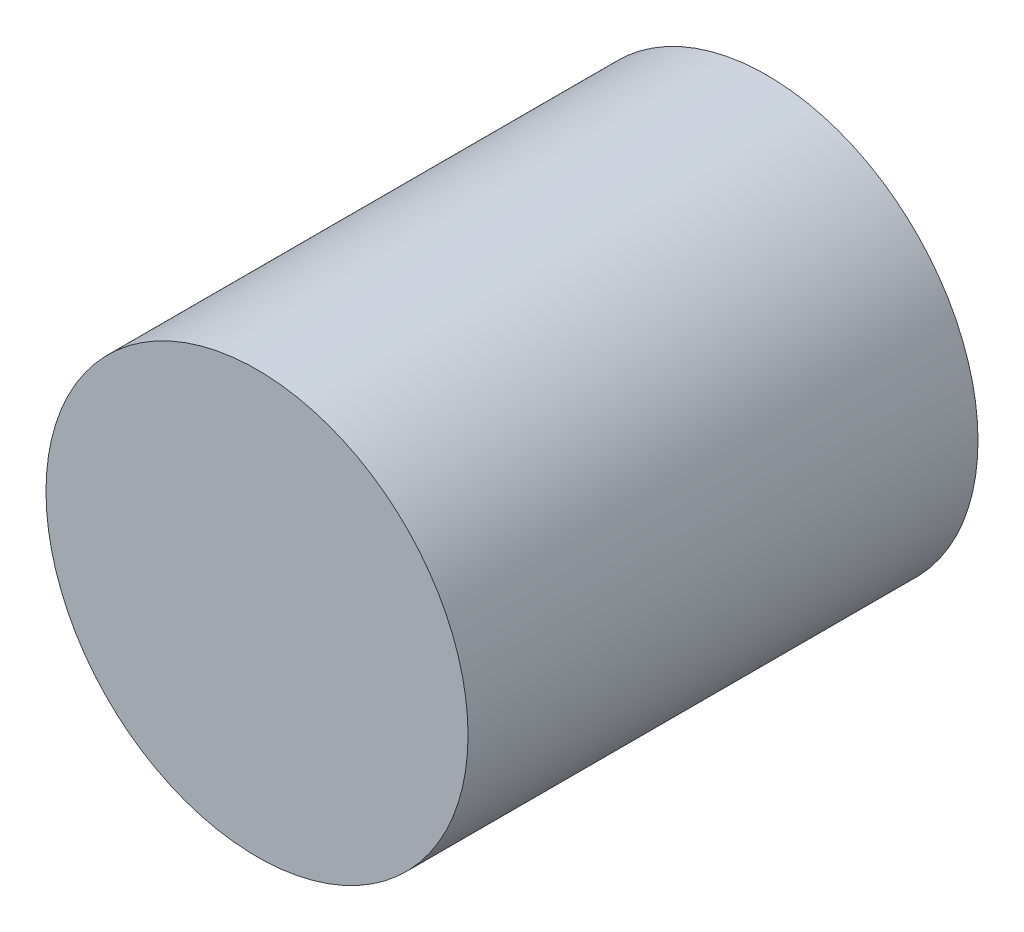
ISO-10303-21;
HEADER;
FILE_DESCRIPTION(('STEP AP214'),'2;1');
FILE_NAME('part.step','',(''),(''),'','','');
FILE_SCHEMA(('AUTOMOTIVE_DESIGN { 1 0 10303 214 1 1 1 1 }'));
ENDSEC;
DATA;
#1=APPLICATION_CONTEXT('core data for automotive mechanical design processes');
#2=APPLICATION_PROTOCOL_DEFINITION('international standard','automotive_design',2000,#1);
#3=PRODUCT_CONTEXT('',#1,'mechanical');
#4=PRODUCT('Part','Part','',(#3));
#5=PRODUCT_RELATED_PRODUCT_CATEGORY('part','',(#4));
#6=PRODUCT_DEFINITION_FORMATION('','',#4);
#7=PRODUCT_DEFINITION_CONTEXT('part definition',#1,'design');
#8=PRODUCT_DEFINITION('design','',#6,#7);
#9=PRODUCT_DEFINITION_SHAPE('','',#8);
#10=(LENGTH_UNIT() NAMED_UNIT(*) SI_UNIT(.MILLI.,.METRE.));
#11=(NAMED_UNIT(*) PLANE_ANGLE_UNIT() SI_UNIT($,.RADIAN.));
#12=(NAMED_UNIT(*) SI_UNIT($,.STERADIAN.) SOLID_ANGLE_UNIT());
#13=UNCERTAINTY_MEASURE_WITH_UNIT(LENGTH_MEASURE(1.E-05),#10,'distance_accuracy_value','');
#14=(GEOMETRIC_REPRESENTATION_CONTEXT(3) GLOBAL_UNCERTAINTY_ASSIGNED_CONTEXT((#13)) GLOBAL_UNIT_ASSIGNED_CONTEXT((#10,
#11,#12)) REPRESENTATION_CONTEXT('',''));
#15=CARTESIAN_POINT('',(0.,0.,0.));
#16=DIRECTION('',(0.,0.,1.));
#17=DIRECTION('',(1.,0.,0.));
#18=AXIS2_PLACEMENT_3D('',#15,#16,#17);
#19=CARTESIAN_POINT('',(29.6107155705201,-2.54359971788886,-3.683));
#20=DIRECTION('',(0.,0.,-1.));
#21=DIRECTION('',(-1.,0.,0.));
#22=AXIS2_PLACEMENT_3D('',#19,#20,#21);
#23=PLANE('',#22);
#24=CARTESIAN_POINT('',(29.6107155705201,-2.54359971788886,-3.683));
#25=DIRECTION('',(0.,0.,1.));
#26=DIRECTION('',(1.,0.,0.));
#27=AXIS2_PLACEMENT_3D('',#24,#25,#26);
#28=CIRCLE('',#27,1.524);
#29=CARTESIAN_POINT('',(31.1347155705201,-2.54359971788886,-3.683));
#30=VERTEX_POINT('',#29);
#31=EDGE_CURVE('E18',#30,#30,#28,.T.);
#32=ORIENTED_EDGE('',*,*,#31,.F.);
#33=EDGE_LOOP('',(#32));
#34=FACE_BOUND('',#33,.T.);
#35=ADVANCED_FACE('F15',(#34),#23,.T.);
#36=CARTESIAN_POINT('',(29.6107155705201,-2.54359971788886,0.));
#37=DIRECTION('',(0.,0.,-1.));
#38=DIRECTION('',(-1.,0.,0.));
#39=AXIS2_PLACEMENT_3D('',#36,#37,#38);
#40=PLANE('',#39);
#41=CARTESIAN_POINT('',(29.6107155705201,-2.54359971788886,0.));
#42=DIRECTION('',(0.,0.,1.));
#43=DIRECTION('',(1.,0.,0.));
#44=AXIS2_PLACEMENT_3D('',#41,#42,#43);
#45=CIRCLE('',#44,1.524);
#46=CARTESIAN_POINT('',(31.1347155705201,-2.54359971788886,0.));
#47=VERTEX_POINT('',#46);
#48=EDGE_CURVE('E10',#47,#47,#45,.F.);
#49=ORIENTED_EDGE('',*,*,#48,.F.);
#50=EDGE_LOOP('',(#49));
#51=FACE_BOUND('',#50,.T.);
#52=ADVANCED_FACE('F30',(#51),#40,.F.);
#53=CARTESIAN_POINT('',(29.6107155705201,-2.54359971788886,-3.683));
#54=DIRECTION('',(0.,0.,1.));
#55=DIRECTION('',(1.,0.,0.));
#56=AXIS2_PLACEMENT_3D('',#53,#54,#55);
#57=CYLINDRICAL_SURFACE('',#56,1.524);
#58=ORIENTED_EDGE('',*,*,#31,.T.);
#59=EDGE_LOOP('',(#58));
#60=FACE_BOUND('',#59,.T.);
#61=ORIENTED_EDGE('',*,*,#48,.T.);
#62=EDGE_LOOP('',(#61));
#63=FACE_BOUND('',#62,.T.);
#64=ADVANCED_FACE('F27',(#60,#63),#57,.T.);
#65=CLOSED_SHELL('',(#35,#52,#64));
#66=MANIFOLD_SOLID_BREP('B1',#65);
#67=ADVANCED_BREP_SHAPE_REPRESENTATION('',(#18,#66),#14);
#68=SHAPE_DEFINITION_REPRESENTATION(#9,#67);
ENDSEC;
END-ISO-10303-21;
